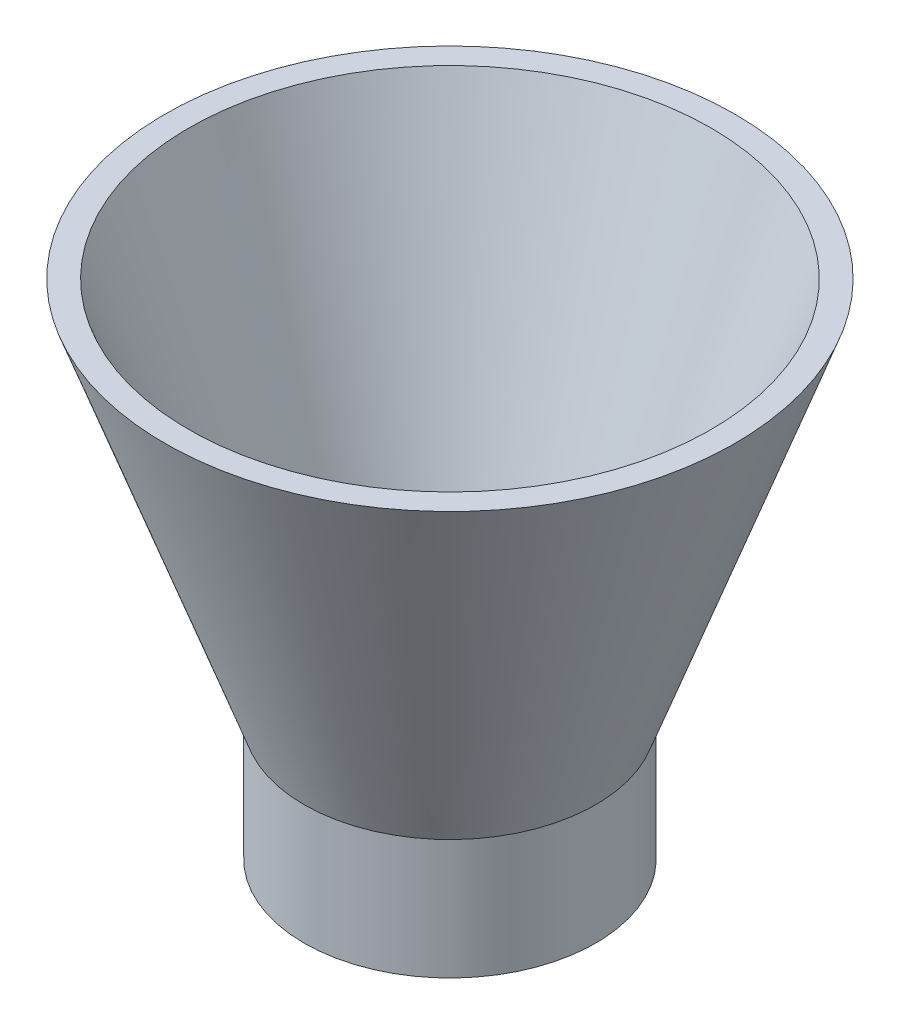
ISO-10303-21;
HEADER;
FILE_DESCRIPTION(('STEP AP214'),'2;1');
FILE_NAME('part.step','',(''),(''),'','','');
FILE_SCHEMA(('AUTOMOTIVE_DESIGN { 1 0 10303 214 1 1 1 1 }'));
ENDSEC;
DATA;
#1=APPLICATION_CONTEXT('core data for automotive mechanical design processes');
#2=APPLICATION_PROTOCOL_DEFINITION('international standard','automotive_design',2000,#1);
#3=PRODUCT_CONTEXT('',#1,'mechanical');
#4=PRODUCT('Part','Part','',(#3));
#5=PRODUCT_RELATED_PRODUCT_CATEGORY('part','',(#4));
#6=PRODUCT_DEFINITION_FORMATION('','',#4);
#7=PRODUCT_DEFINITION_CONTEXT('part definition',#1,'design');
#8=PRODUCT_DEFINITION('design','',#6,#7);
#9=PRODUCT_DEFINITION_SHAPE('','',#8);
#10=(LENGTH_UNIT() NAMED_UNIT(*) SI_UNIT(.MILLI.,.METRE.));
#11=(NAMED_UNIT(*) PLANE_ANGLE_UNIT() SI_UNIT($,.RADIAN.));
#12=(NAMED_UNIT(*) SI_UNIT($,.STERADIAN.) SOLID_ANGLE_UNIT());
#13=UNCERTAINTY_MEASURE_WITH_UNIT(LENGTH_MEASURE(1.E-05),#10,'distance_accuracy_value','');
#14=(GEOMETRIC_REPRESENTATION_CONTEXT(3) GLOBAL_UNCERTAINTY_ASSIGNED_CONTEXT((#13)) GLOBAL_UNIT_ASSIGNED_CONTEXT((#10,
#11,#12)) REPRESENTATION_CONTEXT('',''));
#15=CARTESIAN_POINT('',(0.,0.,0.));
#16=DIRECTION('',(0.,0.,1.));
#17=DIRECTION('',(1.,0.,0.));
#18=AXIS2_PLACEMENT_3D('',#15,#16,#17);
#19=CARTESIAN_POINT('',(0.,0.,0.));
#20=DIRECTION('',(0.,1.,0.));
#21=DIRECTION('',(0.,0.,1.));
#22=AXIS2_PLACEMENT_3D('',#19,#20,#21);
#23=CONICAL_SURFACE('',#22,19.3675,0.349065850398862);
#24=CARTESIAN_POINT('',(0.,50.8,0.));
#25=DIRECTION('',(0.,-1.,0.));
#26=DIRECTION('',(0.,0.,-1.));
#27=AXIS2_PLACEMENT_3D('',#24,#25,#26);
#28=CIRCLE('',#27,37.8571879007229);
#29=CARTESIAN_POINT('',(0.,50.8,-37.8571879007229));
#30=VERTEX_POINT('',#29);
#31=EDGE_CURVE('E10',#30,#30,#28,.T.);
#32=ORIENTED_EDGE('',*,*,#31,.T.);
#33=EDGE_LOOP('',(#32));
#34=FACE_BOUND('',#33,.T.);
#35=CARTESIAN_POINT('',(0.,0.,0.));
#36=DIRECTION('',(0.,-1.,0.));
#37=DIRECTION('',(0.,0.,-1.));
#38=AXIS2_PLACEMENT_3D('',#35,#36,#37);
#39=CIRCLE('',#38,19.3675);
#40=CARTESIAN_POINT('',(0.,0.,-19.3675));
#41=VERTEX_POINT('',#40);
#42=EDGE_CURVE('E55',#41,#41,#39,.T.);
#43=ORIENTED_EDGE('',*,*,#42,.F.);
#44=EDGE_LOOP('',(#43));
#45=FACE_BOUND('',#44,.T.);
#46=ADVANCED_FACE('F33',(#34,#45),#23,.T.);
#47=CARTESIAN_POINT('',(-1.11022302462515E-13,50.8,0.));
#48=DIRECTION('',(0.,1.,0.));
#49=DIRECTION('',(0.,0.,1.));
#50=AXIS2_PLACEMENT_3D('',#47,#48,#49);
#51=PLANE('',#50);
#52=CARTESIAN_POINT('',(0.,50.8,0.));
#53=DIRECTION('',(0.,-1.,0.));
#54=DIRECTION('',(0.,0.,-1.));
#55=AXIS2_PLACEMENT_3D('',#52,#53,#54);
#56=CIRCLE('',#55,34.6821879007229);
#57=CARTESIAN_POINT('',(0.,50.8,-34.6821879007229));
#58=VERTEX_POINT('',#57);
#59=EDGE_CURVE('E39',#58,#58,#56,.T.);
#60=ORIENTED_EDGE('',*,*,#59,.T.);
#61=EDGE_LOOP('',(#60));
#62=FACE_BOUND('',#61,.T.);
#63=ORIENTED_EDGE('',*,*,#31,.F.);
#64=EDGE_LOOP('',(#63));
#65=FACE_BOUND('',#64,.T.);
#66=ADVANCED_FACE('F63',(#62,#65),#51,.T.);
#67=CARTESIAN_POINT('',(0.,50.8,0.));
#68=DIRECTION('',(0.,1.,0.));
#69=DIRECTION('',(0.,0.,1.));
#70=AXIS2_PLACEMENT_3D('',#67,#68,#69);
#71=CONICAL_SURFACE('',#70,34.6821879007229,0.349065850398862);
#72=CARTESIAN_POINT('',(0.,0.,0.));
#73=DIRECTION('',(0.,-1.,0.));
#74=DIRECTION('',(0.,0.,-1.));
#75=AXIS2_PLACEMENT_3D('',#72,#73,#74);
#76=CIRCLE('',#75,16.1925);
#77=CARTESIAN_POINT('',(0.,0.,-16.1925));
#78=VERTEX_POINT('',#77);
#79=EDGE_CURVE('E43',#78,#78,#76,.T.);
#80=ORIENTED_EDGE('',*,*,#79,.T.);
#81=EDGE_LOOP('',(#80));
#82=FACE_BOUND('',#81,.T.);
#83=ORIENTED_EDGE('',*,*,#59,.F.);
#84=EDGE_LOOP('',(#83));
#85=FACE_BOUND('',#84,.T.);
#86=ADVANCED_FACE('F67',(#82,#85),#71,.F.);
#87=CARTESIAN_POINT('',(0.,0.,0.));
#88=DIRECTION('',(0.,-1.,0.));
#89=DIRECTION('',(0.,0.,-1.));
#90=AXIS2_PLACEMENT_3D('',#87,#88,#89);
#91=CYLINDRICAL_SURFACE('',#90,16.1925);
#92=CARTESIAN_POINT('',(0.,-12.7,0.));
#93=DIRECTION('',(0.,-1.,0.));
#94=DIRECTION('',(0.,0.,-1.));
#95=AXIS2_PLACEMENT_3D('',#92,#93,#94);
#96=CIRCLE('',#95,16.1925);
#97=CARTESIAN_POINT('',(0.,-12.7,-16.1925));
#98=VERTEX_POINT('',#97);
#99=EDGE_CURVE('E47',#98,#98,#96,.T.);
#100=ORIENTED_EDGE('',*,*,#99,.T.);
#101=EDGE_LOOP('',(#100));
#102=FACE_BOUND('',#101,.T.);
#103=ORIENTED_EDGE('',*,*,#79,.F.);
#104=EDGE_LOOP('',(#103));
#105=FACE_BOUND('',#104,.T.);
#106=ADVANCED_FACE('F71',(#102,#105),#91,.F.);
#107=CARTESIAN_POINT('',(-1.85445341000467E-12,-12.6999999999988,0.));
#108=DIRECTION('',(0.,-1.,0.));
#109=DIRECTION('',(0.,0.,-1.));
#110=AXIS2_PLACEMENT_3D('',#107,#108,#109);
#111=PLANE('',#110);
#112=ORIENTED_EDGE('',*,*,#99,.F.);
#113=EDGE_LOOP('',(#112));
#114=FACE_BOUND('',#113,.T.);
#115=ADVANCED_FACE('F78',(#114),#111,.F.);
#116=CARTESIAN_POINT('',(-1.27483424935571E-12,-15.9206029927953,0.));
#117=DIRECTION('',(0.,1.,0.));
#118=DIRECTION('',(0.,0.,1.));
#119=AXIS2_PLACEMENT_3D('',#116,#117,#118);
#120=PLANE('',#119);
#121=CARTESIAN_POINT('',(0.,-15.9206029927961,0.));
#122=DIRECTION('',(0.,-1.,0.));
#123=DIRECTION('',(0.,0.,-1.));
#124=AXIS2_PLACEMENT_3D('',#121,#122,#123);
#125=CIRCLE('',#124,19.3675);
#126=CARTESIAN_POINT('',(0.,-15.9206029927961,-19.3675));
#127=VERTEX_POINT('',#126);
#128=EDGE_CURVE('E52',#127,#127,#125,.T.);
#129=ORIENTED_EDGE('',*,*,#128,.T.);
#130=EDGE_LOOP('',(#129));
#131=FACE_BOUND('',#130,.T.);
#132=ADVANCED_FACE('F82',(#131),#120,.F.);
#133=CARTESIAN_POINT('',(0.,0.,0.));
#134=DIRECTION('',(0.,-1.,0.));
#135=DIRECTION('',(0.,0.,-1.));
#136=AXIS2_PLACEMENT_3D('',#133,#134,#135);
#137=CYLINDRICAL_SURFACE('',#136,19.3675);
#138=ORIENTED_EDGE('',*,*,#42,.T.);
#139=EDGE_LOOP('',(#138));
#140=FACE_BOUND('',#139,.T.);
#141=ORIENTED_EDGE('',*,*,#128,.F.);
#142=EDGE_LOOP('',(#141));
#143=FACE_BOUND('',#142,.T.);
#144=ADVANCED_FACE('F59',(#140,#143),#137,.T.);
#145=CLOSED_SHELL('',(#46,#66,#86,#106,#115,#132,#144));
#146=MANIFOLD_SOLID_BREP('B2',#145);
#147=ADVANCED_BREP_SHAPE_REPRESENTATION('',(#18,#146),#14);
#148=SHAPE_DEFINITION_REPRESENTATION(#9,#147);
ENDSEC;
END-ISO-10303-21;
